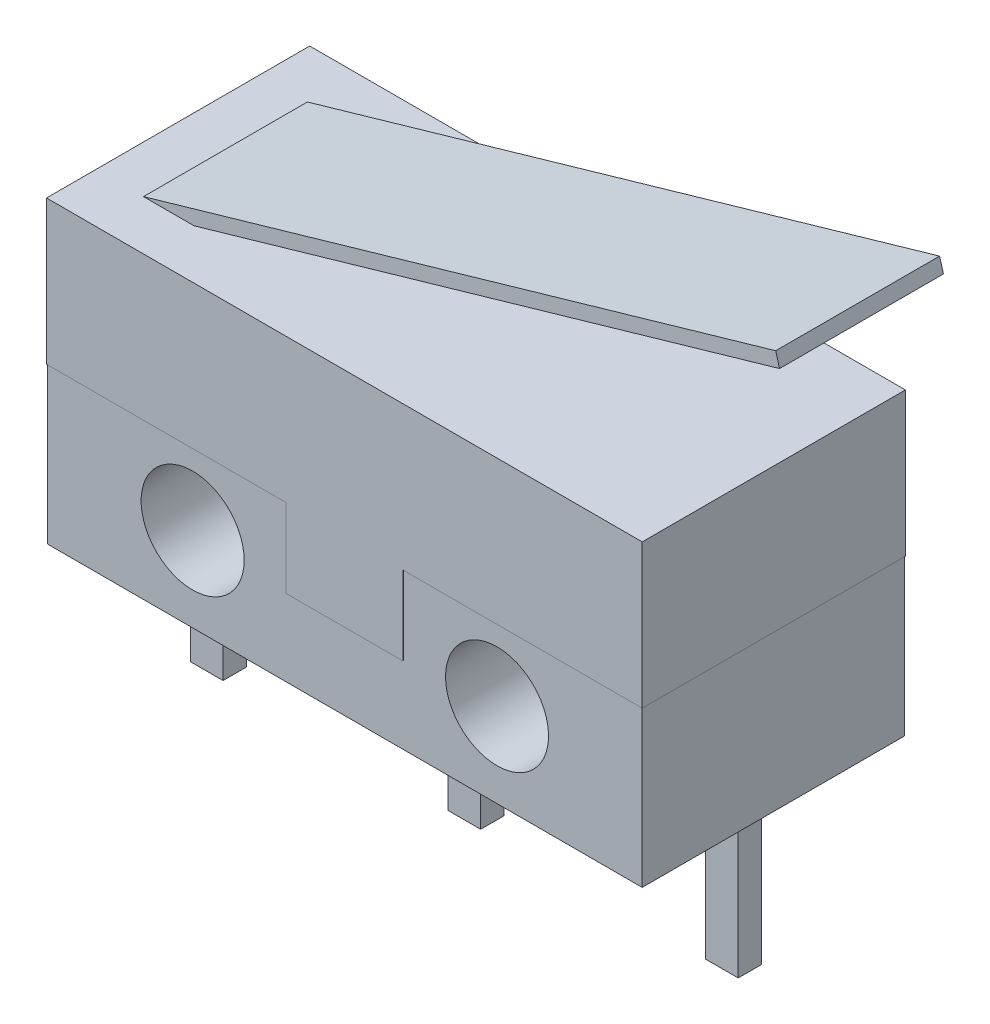
ISO-10303-21;
HEADER;
FILE_DESCRIPTION(('STEP AP214'),'2;1');
FILE_NAME('part.step','',(''),(''),'','','');
FILE_SCHEMA(('AUTOMOTIVE_DESIGN { 1 0 10303 214 1 1 1 1 }'));
ENDSEC;
DATA;
#1=APPLICATION_CONTEXT('core data for automotive mechanical design processes');
#2=APPLICATION_PROTOCOL_DEFINITION('international standard','automotive_design',2000,#1);
#3=PRODUCT_CONTEXT('',#1,'mechanical');
#4=PRODUCT('Part','Part','',(#3));
#5=PRODUCT_RELATED_PRODUCT_CATEGORY('part','',(#4));
#6=PRODUCT_DEFINITION_FORMATION('','',#4);
#7=PRODUCT_DEFINITION_CONTEXT('part definition',#1,'design');
#8=PRODUCT_DEFINITION('design','',#6,#7);
#9=PRODUCT_DEFINITION_SHAPE('','',#8);
#10=(LENGTH_UNIT() NAMED_UNIT(*) SI_UNIT(.MILLI.,.METRE.));
#11=(NAMED_UNIT(*) PLANE_ANGLE_UNIT() SI_UNIT($,.RADIAN.));
#12=(NAMED_UNIT(*) SI_UNIT($,.STERADIAN.) SOLID_ANGLE_UNIT());
#13=UNCERTAINTY_MEASURE_WITH_UNIT(LENGTH_MEASURE(1.E-05),#10,'distance_accuracy_value','');
#14=(GEOMETRIC_REPRESENTATION_CONTEXT(3) GLOBAL_UNCERTAINTY_ASSIGNED_CONTEXT((#13)) GLOBAL_UNIT_ASSIGNED_CONTEXT((#10,
#11,#12)) REPRESENTATION_CONTEXT('',''));
#15=CARTESIAN_POINT('',(0.,0.,0.));
#16=DIRECTION('',(0.,0.,1.));
#17=DIRECTION('',(1.,0.,0.));
#18=AXIS2_PLACEMENT_3D('',#15,#16,#17);
#19=CARTESIAN_POINT('',(6.35,-3.2,2.8));
#20=DIRECTION('',(-1.,0.,0.));
#21=DIRECTION('',(0.,0.,1.));
#22=AXIS2_PLACEMENT_3D('',#19,#20,#21);
#23=PLANE('',#22);
#24=DIRECTION('',(0.,0.,-1.));
#25=VECTOR('',#24,1.);
#26=CARTESIAN_POINT('',(6.35,0.124777874678921,2.81));
#27=LINE('',#26,#25);
#28=CARTESIAN_POINT('',(6.35,0.124777874678921,2.8));
#29=VERTEX_POINT('',#28);
#30=CARTESIAN_POINT('',(6.35,0.124777874678921,-2.8));
#31=VERTEX_POINT('',#30);
#32=EDGE_CURVE('E26',#29,#31,#27,.T.);
#33=ORIENTED_EDGE('',*,*,#32,.F.);
#34=DIRECTION('',(0.,1.,0.));
#35=VECTOR('',#34,1.);
#36=CARTESIAN_POINT('',(6.35,-3.2,2.8));
#37=LINE('',#36,#35);
#38=CARTESIAN_POINT('',(6.35,-3.2,2.8));
#39=VERTEX_POINT('',#38);
#40=EDGE_CURVE('E484',#39,#29,#37,.T.);
#41=ORIENTED_EDGE('',*,*,#40,.F.);
#42=DIRECTION('',(0.,0.,-1.));
#43=VECTOR('',#42,1.);
#44=CARTESIAN_POINT('',(6.35,-3.2,2.8));
#45=LINE('',#44,#43);
#46=CARTESIAN_POINT('',(6.35,-3.2,-2.8));
#47=VERTEX_POINT('',#46);
#48=EDGE_CURVE('E486',#39,#47,#45,.T.);
#49=ORIENTED_EDGE('',*,*,#48,.T.);
#50=DIRECTION('',(0.,1.,0.));
#51=VECTOR('',#50,1.);
#52=CARTESIAN_POINT('',(6.35,-3.2,-2.8));
#53=LINE('',#52,#51);
#54=EDGE_CURVE('E482',#47,#31,#53,.T.);
#55=ORIENTED_EDGE('',*,*,#54,.T.);
#56=EDGE_LOOP('',(#33,#41,#49,#55));
#57=FACE_BOUND('',#56,.T.);
#58=ADVANCED_FACE('F17',(#57),#23,.F.);
#59=CARTESIAN_POINT('',(6.35,-3.2,2.8));
#60=DIRECTION('',(0.,1.,0.));
#61=DIRECTION('',(-1.,0.,0.));
#62=AXIS2_PLACEMENT_3D('',#59,#60,#61);
#63=PLANE('',#62);
#64=DIRECTION('',(0.,0.,-1.));
#65=VECTOR('',#64,1.);
#66=CARTESIAN_POINT('',(5.15,-3.2,-0.25));
#67=LINE('',#66,#65);
#68=CARTESIAN_POINT('',(5.15,-3.2,0.25));
#69=VERTEX_POINT('',#68);
#70=CARTESIAN_POINT('',(5.15,-3.2,-0.25));
#71=VERTEX_POINT('',#70);
#72=EDGE_CURVE('E430',#69,#71,#67,.T.);
#73=ORIENTED_EDGE('',*,*,#72,.F.);
#74=DIRECTION('',(-1.,0.,0.));
#75=VECTOR('',#74,1.);
#76=CARTESIAN_POINT('',(5.85,-3.2,0.25));
#77=LINE('',#76,#75);
#78=CARTESIAN_POINT('',(5.85,-3.2,0.25));
#79=VERTEX_POINT('',#78);
#80=EDGE_CURVE('E400',#79,#69,#77,.T.);
#81=ORIENTED_EDGE('',*,*,#80,.F.);
#82=DIRECTION('',(0.,0.,1.));
#83=VECTOR('',#82,1.);
#84=CARTESIAN_POINT('',(5.85,-3.2,-0.25));
#85=LINE('',#84,#83);
#86=CARTESIAN_POINT('',(5.85,-3.2,-0.25));
#87=VERTEX_POINT('',#86);
#88=EDGE_CURVE('E418',#87,#79,#85,.T.);
#89=ORIENTED_EDGE('',*,*,#88,.F.);
#90=DIRECTION('',(1.,0.,0.));
#91=VECTOR('',#90,1.);
#92=CARTESIAN_POINT('',(5.85,-3.2,-0.25));
#93=LINE('',#92,#91);
#94=EDGE_CURVE('E424',#71,#87,#93,.T.);
#95=ORIENTED_EDGE('',*,*,#94,.F.);
#96=EDGE_LOOP('',(#73,#81,#89,#95));
#97=FACE_BOUND('',#96,.T.);
#98=DIRECTION('',(1.,0.,0.));
#99=VECTOR('',#98,1.);
#100=CARTESIAN_POINT('',(6.35,-3.2,-2.8));
#101=LINE('',#100,#99);
#102=CARTESIAN_POINT('',(-6.35,-3.2,-2.8));
#103=VERTEX_POINT('',#102);
#104=EDGE_CURVE('E488',#103,#47,#101,.T.);
#105=ORIENTED_EDGE('',*,*,#104,.T.);
#106=ORIENTED_EDGE('',*,*,#48,.F.);
#107=DIRECTION('',(1.,0.,0.));
#108=VECTOR('',#107,1.);
#109=CARTESIAN_POINT('',(6.35,-3.2,2.8));
#110=LINE('',#109,#108);
#111=CARTESIAN_POINT('',(-6.35,-3.2,2.8));
#112=VERTEX_POINT('',#111);
#113=EDGE_CURVE('E481',#112,#39,#110,.T.);
#114=ORIENTED_EDGE('',*,*,#113,.F.);
#115=DIRECTION('',(0.,0.,-1.));
#116=VECTOR('',#115,1.);
#117=CARTESIAN_POINT('',(-6.35,-3.2,2.8));
#118=LINE('',#117,#116);
#119=EDGE_CURVE('E21',#112,#103,#118,.T.);
#120=ORIENTED_EDGE('',*,*,#119,.T.);
#121=EDGE_LOOP('',(#105,#106,#114,#120));
#122=FACE_BOUND('',#121,.T.);
#123=DIRECTION('',(0.,0.,-1.));
#124=VECTOR('',#123,1.);
#125=CARTESIAN_POINT('',(-0.35,-3.2,-0.25));
#126=LINE('',#125,#124);
#127=CARTESIAN_POINT('',(-0.35,-3.2,0.25));
#128=VERTEX_POINT('',#127);
#129=CARTESIAN_POINT('',(-0.35,-3.2,-0.25));
#130=VERTEX_POINT('',#129);
#131=EDGE_CURVE('E433',#128,#130,#126,.T.);
#132=ORIENTED_EDGE('',*,*,#131,.F.);
#133=DIRECTION('',(-1.,0.,0.));
#134=VECTOR('',#133,1.);
#135=CARTESIAN_POINT('',(0.35,-3.2,0.25));
#136=LINE('',#135,#134);
#137=CARTESIAN_POINT('',(0.35,-3.2,0.25));
#138=VERTEX_POINT('',#137);
#139=EDGE_CURVE('E438',#138,#128,#136,.T.);
#140=ORIENTED_EDGE('',*,*,#139,.F.);
#141=DIRECTION('',(0.,0.,1.));
#142=VECTOR('',#141,1.);
#143=CARTESIAN_POINT('',(0.35,-3.2,-0.25));
#144=LINE('',#143,#142);
#145=CARTESIAN_POINT('',(0.35,-3.2,-0.25));
#146=VERTEX_POINT('',#145);
#147=EDGE_CURVE('E450',#146,#138,#144,.T.);
#148=ORIENTED_EDGE('',*,*,#147,.F.);
#149=DIRECTION('',(1.,0.,0.));
#150=VECTOR('',#149,1.);
#151=CARTESIAN_POINT('',(0.35,-3.2,-0.25));
#152=LINE('',#151,#150);
#153=EDGE_CURVE('E447',#130,#146,#152,.T.);
#154=ORIENTED_EDGE('',*,*,#153,.F.);
#155=EDGE_LOOP('',(#132,#140,#148,#154));
#156=FACE_BOUND('',#155,.T.);
#157=DIRECTION('',(0.,0.,-1.));
#158=VECTOR('',#157,1.);
#159=CARTESIAN_POINT('',(-5.85,-3.2,-0.25));
#160=LINE('',#159,#158);
#161=CARTESIAN_POINT('',(-5.85,-3.2,0.25));
#162=VERTEX_POINT('',#161);
#163=CARTESIAN_POINT('',(-5.85,-3.2,-0.25));
#164=VERTEX_POINT('',#163);
#165=EDGE_CURVE('E397',#162,#164,#160,.T.);
#166=ORIENTED_EDGE('',*,*,#165,.F.);
#167=DIRECTION('',(-1.,0.,0.));
#168=VECTOR('',#167,1.);
#169=CARTESIAN_POINT('',(-5.15,-3.2,0.25));
#170=LINE('',#169,#168);
#171=CARTESIAN_POINT('',(-5.15,-3.2,0.25));
#172=VERTEX_POINT('',#171);
#173=EDGE_CURVE('E367',#172,#162,#170,.T.);
#174=ORIENTED_EDGE('',*,*,#173,.F.);
#175=DIRECTION('',(0.,0.,1.));
#176=VECTOR('',#175,1.);
#177=CARTESIAN_POINT('',(-5.15,-3.2,-0.25));
#178=LINE('',#177,#176);
#179=CARTESIAN_POINT('',(-5.15,-3.2,-0.25));
#180=VERTEX_POINT('',#179);
#181=EDGE_CURVE('E385',#180,#172,#178,.T.);
#182=ORIENTED_EDGE('',*,*,#181,.F.);
#183=DIRECTION('',(1.,0.,0.));
#184=VECTOR('',#183,1.);
#185=CARTESIAN_POINT('',(-5.15,-3.2,-0.25));
#186=LINE('',#185,#184);
#187=EDGE_CURVE('E391',#164,#180,#186,.T.);
#188=ORIENTED_EDGE('',*,*,#187,.F.);
#189=EDGE_LOOP('',(#166,#174,#182,#188));
#190=FACE_BOUND('',#189,.T.);
#191=ADVANCED_FACE('F500',(#97,#122,#156,#190),#63,.F.);
#192=CARTESIAN_POINT('',(0.,0.,2.8));
#193=DIRECTION('',(0.,0.,1.));
#194=DIRECTION('',(1.,0.,0.));
#195=AXIS2_PLACEMENT_3D('',#192,#193,#194);
#196=PLANE('',#195);
#197=DIRECTION('',(1.,0.,0.));
#198=VECTOR('',#197,1.);
#199=CARTESIAN_POINT('',(1.25,0.124777874678922,2.8));
#200=LINE('',#199,#198);
#201=CARTESIAN_POINT('',(1.25,0.124777874678922,2.8));
#202=VERTEX_POINT('',#201);
#203=EDGE_CURVE('E40',#202,#29,#200,.T.);
#204=ORIENTED_EDGE('',*,*,#203,.F.);
#205=DIRECTION('',(0.,1.,0.));
#206=VECTOR('',#205,1.);
#207=CARTESIAN_POINT('',(1.25,-1.55638339758589,2.8));
#208=LINE('',#207,#206);
#209=CARTESIAN_POINT('',(1.25,-1.55638339758589,2.8));
#210=VERTEX_POINT('',#209);
#211=EDGE_CURVE('E323',#210,#202,#208,.T.);
#212=ORIENTED_EDGE('',*,*,#211,.F.);
#213=DIRECTION('',(1.,0.,0.));
#214=VECTOR('',#213,1.);
#215=CARTESIAN_POINT('',(-1.25,-1.55638339758589,2.8));
#216=LINE('',#215,#214);
#217=CARTESIAN_POINT('',(-1.25,-1.55638339758589,2.8));
#218=VERTEX_POINT('',#217);
#219=EDGE_CURVE('E320',#218,#210,#216,.T.);
#220=ORIENTED_EDGE('',*,*,#219,.F.);
#221=DIRECTION('',(0.,-1.,0.));
#222=VECTOR('',#221,1.);
#223=CARTESIAN_POINT('',(-1.25,0.124777874678921,2.8));
#224=LINE('',#223,#222);
#225=CARTESIAN_POINT('',(-1.25,0.124777874678921,2.8));
#226=VERTEX_POINT('',#225);
#227=EDGE_CURVE('E317',#226,#218,#224,.T.);
#228=ORIENTED_EDGE('',*,*,#227,.F.);
#229=DIRECTION('',(1.,0.,0.));
#230=VECTOR('',#229,1.);
#231=CARTESIAN_POINT('',(-6.35,0.124777874678921,2.8));
#232=LINE('',#231,#230);
#233=CARTESIAN_POINT('',(-6.35,0.124777874678921,2.8));
#234=VERTEX_POINT('',#233);
#235=EDGE_CURVE('E305',#234,#226,#232,.T.);
#236=ORIENTED_EDGE('',*,*,#235,.F.);
#237=DIRECTION('',(0.,-1.,0.));
#238=VECTOR('',#237,1.);
#239=CARTESIAN_POINT('',(-6.35,-3.2,2.8));
#240=LINE('',#239,#238);
#241=EDGE_CURVE('E479',#234,#112,#240,.T.);
#242=ORIENTED_EDGE('',*,*,#241,.T.);
#243=ORIENTED_EDGE('',*,*,#113,.T.);
#244=ORIENTED_EDGE('',*,*,#40,.T.);
#245=EDGE_LOOP('',(#204,#212,#220,#228,#236,#242,#243,#244));
#246=FACE_BOUND('',#245,.T.);
#247=CARTESIAN_POINT('',(-3.25,-1.4,2.8));
#248=DIRECTION('',(0.,0.,1.));
#249=DIRECTION('',(1.,0.,0.));
#250=AXIS2_PLACEMENT_3D('',#247,#248,#249);
#251=CIRCLE('',#250,1.1);
#252=CARTESIAN_POINT('',(-2.15,-1.4,2.8));
#253=VERTEX_POINT('',#252);
#254=EDGE_CURVE('E473',#253,#253,#251,.T.);
#255=ORIENTED_EDGE('',*,*,#254,.F.);
#256=EDGE_LOOP('',(#255));
#257=FACE_BOUND('',#256,.T.);
#258=CARTESIAN_POINT('',(3.25,-1.4,2.8));
#259=DIRECTION('',(0.,0.,1.));
#260=DIRECTION('',(-1.,0.,0.));
#261=AXIS2_PLACEMENT_3D('',#258,#259,#260);
#262=CIRCLE('',#261,1.1);
#263=CARTESIAN_POINT('',(2.15,-1.4,2.8));
#264=VERTEX_POINT('',#263);
#265=EDGE_CURVE('E467',#264,#264,#262,.T.);
#266=ORIENTED_EDGE('',*,*,#265,.F.);
#267=EDGE_LOOP('',(#266));
#268=FACE_BOUND('',#267,.T.);
#269=ADVANCED_FACE('F510',(#246,#257,#268),#196,.T.);
#270=CARTESIAN_POINT('',(0.,0.,-2.8));
#271=DIRECTION('',(0.,0.,1.));
#272=DIRECTION('',(1.,0.,0.));
#273=AXIS2_PLACEMENT_3D('',#270,#271,#272);
#274=PLANE('',#273);
#275=DIRECTION('',(0.,-1.,0.));
#276=VECTOR('',#275,1.);
#277=CARTESIAN_POINT('',(-6.35,-3.2,-2.8));
#278=LINE('',#277,#276);
#279=CARTESIAN_POINT('',(-6.35,0.124777874678921,-2.8));
#280=VERTEX_POINT('',#279);
#281=EDGE_CURVE('E476',#280,#103,#278,.T.);
#282=ORIENTED_EDGE('',*,*,#281,.F.);
#283=DIRECTION('',(1.,0.,0.));
#284=VECTOR('',#283,1.);
#285=CARTESIAN_POINT('',(-6.35,0.124777874678921,-2.8));
#286=LINE('',#285,#284);
#287=CARTESIAN_POINT('',(-1.25,0.124777874678921,-2.8));
#288=VERTEX_POINT('',#287);
#289=EDGE_CURVE('E271',#280,#288,#286,.T.);
#290=ORIENTED_EDGE('',*,*,#289,.T.);
#291=DIRECTION('',(0.,-1.,0.));
#292=VECTOR('',#291,1.);
#293=CARTESIAN_POINT('',(-1.25,0.124777874678921,-2.8));
#294=LINE('',#293,#292);
#295=CARTESIAN_POINT('',(-1.25,-1.55638339758589,-2.8));
#296=VERTEX_POINT('',#295);
#297=EDGE_CURVE('E293',#288,#296,#294,.T.);
#298=ORIENTED_EDGE('',*,*,#297,.T.);
#299=DIRECTION('',(1.,0.,0.));
#300=VECTOR('',#299,1.);
#301=CARTESIAN_POINT('',(-1.25,-1.55638339758589,-2.8));
#302=LINE('',#301,#300);
#303=CARTESIAN_POINT('',(1.25,-1.55638339758589,-2.8));
#304=VERTEX_POINT('',#303);
#305=EDGE_CURVE('E290',#296,#304,#302,.T.);
#306=ORIENTED_EDGE('',*,*,#305,.T.);
#307=DIRECTION('',(0.,1.,0.));
#308=VECTOR('',#307,1.);
#309=CARTESIAN_POINT('',(1.25,-1.55638339758589,-2.8));
#310=LINE('',#309,#308);
#311=CARTESIAN_POINT('',(1.25,0.124777874678922,-2.8));
#312=VERTEX_POINT('',#311);
#313=EDGE_CURVE('E287',#304,#312,#310,.T.);
#314=ORIENTED_EDGE('',*,*,#313,.T.);
#315=DIRECTION('',(1.,0.,0.));
#316=VECTOR('',#315,1.);
#317=CARTESIAN_POINT('',(1.25,0.124777874678922,-2.8));
#318=LINE('',#317,#316);
#319=EDGE_CURVE('E267',#312,#31,#318,.T.);
#320=ORIENTED_EDGE('',*,*,#319,.T.);
#321=ORIENTED_EDGE('',*,*,#54,.F.);
#322=ORIENTED_EDGE('',*,*,#104,.F.);
#323=EDGE_LOOP('',(#282,#290,#298,#306,#314,#320,#321,#322));
#324=FACE_BOUND('',#323,.T.);
#325=CARTESIAN_POINT('',(-3.25,-1.4,-2.8));
#326=DIRECTION('',(0.,0.,1.));
#327=DIRECTION('',(1.,0.,0.));
#328=AXIS2_PLACEMENT_3D('',#325,#326,#327);
#329=CIRCLE('',#328,1.1);
#330=CARTESIAN_POINT('',(-2.15,-1.4,-2.8));
#331=VERTEX_POINT('',#330);
#332=EDGE_CURVE('E470',#331,#331,#329,.T.);
#333=ORIENTED_EDGE('',*,*,#332,.T.);
#334=EDGE_LOOP('',(#333));
#335=FACE_BOUND('',#334,.T.);
#336=CARTESIAN_POINT('',(3.25,-1.4,-2.8));
#337=DIRECTION('',(0.,0.,1.));
#338=DIRECTION('',(-1.,0.,0.));
#339=AXIS2_PLACEMENT_3D('',#336,#337,#338);
#340=CIRCLE('',#339,1.1);
#341=CARTESIAN_POINT('',(2.15,-1.4,-2.8));
#342=VERTEX_POINT('',#341);
#343=EDGE_CURVE('E466',#342,#342,#340,.T.);
#344=ORIENTED_EDGE('',*,*,#343,.T.);
#345=EDGE_LOOP('',(#344));
#346=FACE_BOUND('',#345,.T.);
#347=ADVANCED_FACE('F508',(#324,#335,#346),#274,.F.);
#348=CARTESIAN_POINT('',(-6.35,-3.2,2.8));
#349=DIRECTION('',(1.,0.,0.));
#350=DIRECTION('',(0.,0.,-1.));
#351=AXIS2_PLACEMENT_3D('',#348,#349,#350);
#352=PLANE('',#351);
#353=ORIENTED_EDGE('',*,*,#241,.F.);
#354=DIRECTION('',(0.,0.,-1.));
#355=VECTOR('',#354,1.);
#356=CARTESIAN_POINT('',(-6.35,0.124777874678921,2.81));
#357=LINE('',#356,#355);
#358=EDGE_CURVE('E11',#234,#280,#357,.T.);
#359=ORIENTED_EDGE('',*,*,#358,.T.);
#360=ORIENTED_EDGE('',*,*,#281,.T.);
#361=ORIENTED_EDGE('',*,*,#119,.F.);
#362=EDGE_LOOP('',(#353,#359,#360,#361));
#363=FACE_BOUND('',#362,.T.);
#364=ADVANCED_FACE('F19',(#363),#352,.F.);
#365=CARTESIAN_POINT('',(6.35,3.2,2.8));
#366=DIRECTION('',(0.,-1.,0.));
#367=DIRECTION('',(1.,0.,0.));
#368=AXIS2_PLACEMENT_3D('',#365,#366,#367);
#369=PLANE('',#368);
#370=DIRECTION('',(0.,0.,-1.));
#371=VECTOR('',#370,1.);
#372=CARTESIAN_POINT('',(-4.26907337581873,3.2,1.75));
#373=LINE('',#372,#371);
#374=CARTESIAN_POINT('',(-4.26907337581873,3.2,1.75));
#375=VERTEX_POINT('',#374);
#376=CARTESIAN_POINT('',(-4.26907337581873,3.2,-1.75));
#377=VERTEX_POINT('',#376);
#378=EDGE_CURVE('E364',#375,#377,#373,.T.);
#379=ORIENTED_EDGE('',*,*,#378,.F.);
#380=DIRECTION('',(1.,0.,0.));
#381=VECTOR('',#380,1.);
#382=CARTESIAN_POINT('',(-4.26907337581873,3.2,1.75));
#383=LINE('',#382,#381);
#384=CARTESIAN_POINT('',(-5.35,3.2,1.75));
#385=VERTEX_POINT('',#384);
#386=EDGE_CURVE('E338',#385,#375,#383,.T.);
#387=ORIENTED_EDGE('',*,*,#386,.F.);
#388=DIRECTION('',(0.,0.,-1.));
#389=VECTOR('',#388,1.);
#390=CARTESIAN_POINT('',(-5.35,3.2,1.75));
#391=LINE('',#390,#389);
#392=CARTESIAN_POINT('',(-5.35,3.2,-1.75));
#393=VERTEX_POINT('',#392);
#394=EDGE_CURVE('E349',#385,#393,#391,.T.);
#395=ORIENTED_EDGE('',*,*,#394,.T.);
#396=DIRECTION('',(1.,0.,0.));
#397=VECTOR('',#396,1.);
#398=CARTESIAN_POINT('',(-4.26907337581873,3.2,-1.75));
#399=LINE('',#398,#397);
#400=EDGE_CURVE('E337',#393,#377,#399,.T.);
#401=ORIENTED_EDGE('',*,*,#400,.T.);
#402=EDGE_LOOP('',(#379,#387,#395,#401));
#403=FACE_BOUND('',#402,.T.);
#404=DIRECTION('',(-1.,0.,0.));
#405=VECTOR('',#404,1.);
#406=CARTESIAN_POINT('',(-6.35,3.2,2.81));
#407=LINE('',#406,#405);
#408=CARTESIAN_POINT('',(6.36,3.2,2.81));
#409=VERTEX_POINT('',#408);
#410=CARTESIAN_POINT('',(-6.36,3.2,2.81));
#411=VERTEX_POINT('',#410);
#412=EDGE_CURVE('E228',#409,#411,#407,.T.);
#413=ORIENTED_EDGE('',*,*,#412,.F.);
#414=DIRECTION('',(0.,0.,1.));
#415=VECTOR('',#414,1.);
#416=CARTESIAN_POINT('',(6.36,3.2,2.81));
#417=LINE('',#416,#415);
#418=CARTESIAN_POINT('',(6.36,3.2,-2.81));
#419=VERTEX_POINT('',#418);
#420=EDGE_CURVE('E265',#419,#409,#417,.T.);
#421=ORIENTED_EDGE('',*,*,#420,.F.);
#422=DIRECTION('',(-1.,0.,0.));
#423=VECTOR('',#422,1.);
#424=CARTESIAN_POINT('',(-6.35,3.2,-2.81));
#425=LINE('',#424,#423);
#426=CARTESIAN_POINT('',(-6.36,3.2,-2.81));
#427=VERTEX_POINT('',#426);
#428=EDGE_CURVE('E252',#419,#427,#425,.T.);
#429=ORIENTED_EDGE('',*,*,#428,.T.);
#430=DIRECTION('',(0.,0.,1.));
#431=VECTOR('',#430,1.);
#432=CARTESIAN_POINT('',(-6.36,3.2,2.81));
#433=LINE('',#432,#431);
#434=EDGE_CURVE('E246',#427,#411,#433,.T.);
#435=ORIENTED_EDGE('',*,*,#434,.T.);
#436=EDGE_LOOP('',(#413,#421,#429,#435));
#437=FACE_BOUND('',#436,.T.);
#438=ADVANCED_FACE('F251',(#403,#437),#369,.F.);
#439=CARTESIAN_POINT('',(-3.25,-1.4,2.8));
#440=DIRECTION('',(0.,0.,-1.));
#441=DIRECTION('',(-1.,0.,0.));
#442=AXIS2_PLACEMENT_3D('',#439,#440,#441);
#443=CYLINDRICAL_SURFACE('',#442,1.1);
#444=ORIENTED_EDGE('',*,*,#254,.T.);
#445=EDGE_LOOP('',(#444));
#446=FACE_BOUND('',#445,.T.);
#447=ORIENTED_EDGE('',*,*,#332,.F.);
#448=EDGE_LOOP('',(#447));
#449=FACE_BOUND('',#448,.T.);
#450=ADVANCED_FACE('F568',(#446,#449),#443,.F.);
#451=CARTESIAN_POINT('',(3.25,-1.4,2.8));
#452=DIRECTION('',(0.,0.,-1.));
#453=DIRECTION('',(-1.,0.,0.));
#454=AXIS2_PLACEMENT_3D('',#451,#452,#453);
#455=CYLINDRICAL_SURFACE('',#454,1.1);
#456=ORIENTED_EDGE('',*,*,#265,.T.);
#457=EDGE_LOOP('',(#456));
#458=FACE_BOUND('',#457,.T.);
#459=ORIENTED_EDGE('',*,*,#343,.F.);
#460=EDGE_LOOP('',(#459));
#461=FACE_BOUND('',#460,.T.);
#462=ADVANCED_FACE('F576',(#458,#461),#455,.F.);
#463=CARTESIAN_POINT('',(-0.35,-6.4,-0.25));
#464=DIRECTION('',(1.,0.,0.));
#465=DIRECTION('',(0.,1.,0.));
#466=AXIS2_PLACEMENT_3D('',#463,#464,#465);
#467=PLANE('',#466);
#468=ORIENTED_EDGE('',*,*,#131,.T.);
#469=DIRECTION('',(0.,1.,0.));
#470=VECTOR('',#469,1.);
#471=CARTESIAN_POINT('',(-0.35,-6.4,-0.25));
#472=LINE('',#471,#470);
#473=CARTESIAN_POINT('',(-0.35,-6.4,-0.25));
#474=VERTEX_POINT('',#473);
#475=EDGE_CURVE('E463',#474,#130,#472,.T.);
#476=ORIENTED_EDGE('',*,*,#475,.F.);
#477=DIRECTION('',(0.,0.,-1.));
#478=VECTOR('',#477,1.);
#479=CARTESIAN_POINT('',(-0.35,-6.4,-0.25));
#480=LINE('',#479,#478);
#481=CARTESIAN_POINT('',(-0.35,-6.4,0.25));
#482=VERTEX_POINT('',#481);
#483=EDGE_CURVE('E434',#482,#474,#480,.T.);
#484=ORIENTED_EDGE('',*,*,#483,.F.);
#485=DIRECTION('',(0.,1.,0.));
#486=VECTOR('',#485,1.);
#487=CARTESIAN_POINT('',(-0.35,-6.4,0.25));
#488=LINE('',#487,#486);
#489=EDGE_CURVE('E444',#482,#128,#488,.T.);
#490=ORIENTED_EDGE('',*,*,#489,.T.);
#491=EDGE_LOOP('',(#468,#476,#484,#490));
#492=FACE_BOUND('',#491,.T.);
#493=ADVANCED_FACE('F580',(#492),#467,.F.);
#494=CARTESIAN_POINT('',(0.35,-6.4,-0.25));
#495=DIRECTION('',(0.,0.,1.));
#496=DIRECTION('',(1.,0.,0.));
#497=AXIS2_PLACEMENT_3D('',#494,#495,#496);
#498=PLANE('',#497);
#499=ORIENTED_EDGE('',*,*,#153,.T.);
#500=DIRECTION('',(0.,1.,0.));
#501=VECTOR('',#500,1.);
#502=CARTESIAN_POINT('',(0.35,-6.4,-0.25));
#503=LINE('',#502,#501);
#504=CARTESIAN_POINT('',(0.35,-6.4,-0.25));
#505=VERTEX_POINT('',#504);
#506=EDGE_CURVE('E460',#505,#146,#503,.T.);
#507=ORIENTED_EDGE('',*,*,#506,.F.);
#508=DIRECTION('',(1.,0.,0.));
#509=VECTOR('',#508,1.);
#510=CARTESIAN_POINT('',(0.35,-6.4,-0.25));
#511=LINE('',#510,#509);
#512=EDGE_CURVE('E437',#474,#505,#511,.T.);
#513=ORIENTED_EDGE('',*,*,#512,.F.);
#514=ORIENTED_EDGE('',*,*,#475,.T.);
#515=EDGE_LOOP('',(#499,#507,#513,#514));
#516=FACE_BOUND('',#515,.T.);
#517=ADVANCED_FACE('F584',(#516),#498,.F.);
#518=CARTESIAN_POINT('',(0.35,-6.4,-0.25));
#519=DIRECTION('',(-1.,0.,0.));
#520=DIRECTION('',(0.,-1.,0.));
#521=AXIS2_PLACEMENT_3D('',#518,#519,#520);
#522=PLANE('',#521);
#523=ORIENTED_EDGE('',*,*,#147,.T.);
#524=DIRECTION('',(0.,1.,0.));
#525=VECTOR('',#524,1.);
#526=CARTESIAN_POINT('',(0.35,-6.4,0.25));
#527=LINE('',#526,#525);
#528=CARTESIAN_POINT('',(0.35,-6.4,0.25));
#529=VERTEX_POINT('',#528);
#530=EDGE_CURVE('E457',#529,#138,#527,.T.);
#531=ORIENTED_EDGE('',*,*,#530,.F.);
#532=DIRECTION('',(0.,0.,1.));
#533=VECTOR('',#532,1.);
#534=CARTESIAN_POINT('',(0.35,-6.4,-0.25));
#535=LINE('',#534,#533);
#536=EDGE_CURVE('E440',#505,#529,#535,.T.);
#537=ORIENTED_EDGE('',*,*,#536,.F.);
#538=ORIENTED_EDGE('',*,*,#506,.T.);
#539=EDGE_LOOP('',(#523,#531,#537,#538));
#540=FACE_BOUND('',#539,.T.);
#541=ADVANCED_FACE('F588',(#540),#522,.F.);
#542=CARTESIAN_POINT('',(0.35,-6.4,0.25));
#543=DIRECTION('',(0.,0.,-1.));
#544=DIRECTION('',(-1.,0.,0.));
#545=AXIS2_PLACEMENT_3D('',#542,#543,#544);
#546=PLANE('',#545);
#547=ORIENTED_EDGE('',*,*,#139,.T.);
#548=ORIENTED_EDGE('',*,*,#489,.F.);
#549=DIRECTION('',(-1.,0.,0.));
#550=VECTOR('',#549,1.);
#551=CARTESIAN_POINT('',(0.35,-6.4,0.25));
#552=LINE('',#551,#550);
#553=EDGE_CURVE('E442',#529,#482,#552,.T.);
#554=ORIENTED_EDGE('',*,*,#553,.F.);
#555=ORIENTED_EDGE('',*,*,#530,.T.);
#556=EDGE_LOOP('',(#547,#548,#554,#555));
#557=FACE_BOUND('',#556,.T.);
#558=ADVANCED_FACE('F592',(#557),#546,.F.);
#559=CARTESIAN_POINT('',(0.,-6.4,0.));
#560=DIRECTION('',(0.,-1.,0.));
#561=DIRECTION('',(0.,0.,-1.));
#562=AXIS2_PLACEMENT_3D('',#559,#560,#561);
#563=PLANE('',#562);
#564=ORIENTED_EDGE('',*,*,#483,.T.);
#565=ORIENTED_EDGE('',*,*,#512,.T.);
#566=ORIENTED_EDGE('',*,*,#536,.T.);
#567=ORIENTED_EDGE('',*,*,#553,.T.);
#568=EDGE_LOOP('',(#564,#565,#566,#567));
#569=FACE_BOUND('',#568,.T.);
#570=ADVANCED_FACE('F596',(#569),#563,.T.);
#571=CARTESIAN_POINT('',(5.15,-6.4,-0.25));
#572=DIRECTION('',(1.,0.,0.));
#573=DIRECTION('',(0.,1.,0.));
#574=AXIS2_PLACEMENT_3D('',#571,#572,#573);
#575=PLANE('',#574);
#576=ORIENTED_EDGE('',*,*,#72,.T.);
#577=DIRECTION('',(0.,1.,0.));
#578=VECTOR('',#577,1.);
#579=CARTESIAN_POINT('',(5.15,-6.4,-0.25));
#580=LINE('',#579,#578);
#581=CARTESIAN_POINT('',(5.15,-6.4,-0.25));
#582=VERTEX_POINT('',#581);
#583=EDGE_CURVE('E427',#582,#71,#580,.T.);
#584=ORIENTED_EDGE('',*,*,#583,.F.);
#585=DIRECTION('',(0.,0.,-1.));
#586=VECTOR('',#585,1.);
#587=CARTESIAN_POINT('',(5.15,-6.4,-0.25));
#588=LINE('',#587,#586);
#589=CARTESIAN_POINT('',(5.15,-6.4,0.25));
#590=VERTEX_POINT('',#589);
#591=EDGE_CURVE('E403',#590,#582,#588,.T.);
#592=ORIENTED_EDGE('',*,*,#591,.F.);
#593=DIRECTION('',(0.,1.,0.));
#594=VECTOR('',#593,1.);
#595=CARTESIAN_POINT('',(5.15,-6.4,0.25));
#596=LINE('',#595,#594);
#597=EDGE_CURVE('E412',#590,#69,#596,.T.);
#598=ORIENTED_EDGE('',*,*,#597,.T.);
#599=EDGE_LOOP('',(#576,#584,#592,#598));
#600=FACE_BOUND('',#599,.T.);
#601=ADVANCED_FACE('F600',(#600),#575,.F.);
#602=CARTESIAN_POINT('',(5.85,-6.4,-0.25));
#603=DIRECTION('',(0.,0.,1.));
#604=DIRECTION('',(1.,0.,0.));
#605=AXIS2_PLACEMENT_3D('',#602,#603,#604);
#606=PLANE('',#605);
#607=ORIENTED_EDGE('',*,*,#94,.T.);
#608=DIRECTION('',(0.,1.,0.));
#609=VECTOR('',#608,1.);
#610=CARTESIAN_POINT('',(5.85,-6.4,-0.25));
#611=LINE('',#610,#609);
#612=CARTESIAN_POINT('',(5.85,-6.4,-0.25));
#613=VERTEX_POINT('',#612);
#614=EDGE_CURVE('E421',#613,#87,#611,.T.);
#615=ORIENTED_EDGE('',*,*,#614,.F.);
#616=DIRECTION('',(1.,0.,0.));
#617=VECTOR('',#616,1.);
#618=CARTESIAN_POINT('',(5.85,-6.4,-0.25));
#619=LINE('',#618,#617);
#620=EDGE_CURVE('E405',#582,#613,#619,.T.);
#621=ORIENTED_EDGE('',*,*,#620,.F.);
#622=ORIENTED_EDGE('',*,*,#583,.T.);
#623=EDGE_LOOP('',(#607,#615,#621,#622));
#624=FACE_BOUND('',#623,.T.);
#625=ADVANCED_FACE('F604',(#624),#606,.F.);
#626=CARTESIAN_POINT('',(5.85,-6.4,-0.25));
#627=DIRECTION('',(-1.,0.,0.));
#628=DIRECTION('',(0.,-1.,0.));
#629=AXIS2_PLACEMENT_3D('',#626,#627,#628);
#630=PLANE('',#629);
#631=ORIENTED_EDGE('',*,*,#88,.T.);
#632=DIRECTION('',(0.,1.,0.));
#633=VECTOR('',#632,1.);
#634=CARTESIAN_POINT('',(5.85,-6.4,0.25));
#635=LINE('',#634,#633);
#636=CARTESIAN_POINT('',(5.85,-6.4,0.25));
#637=VERTEX_POINT('',#636);
#638=EDGE_CURVE('E415',#637,#79,#635,.T.);
#639=ORIENTED_EDGE('',*,*,#638,.F.);
#640=DIRECTION('',(0.,0.,1.));
#641=VECTOR('',#640,1.);
#642=CARTESIAN_POINT('',(5.85,-6.4,-0.25));
#643=LINE('',#642,#641);
#644=EDGE_CURVE('E407',#613,#637,#643,.T.);
#645=ORIENTED_EDGE('',*,*,#644,.F.);
#646=ORIENTED_EDGE('',*,*,#614,.T.);
#647=EDGE_LOOP('',(#631,#639,#645,#646));
#648=FACE_BOUND('',#647,.T.);
#649=ADVANCED_FACE('F608',(#648),#630,.F.);
#650=CARTESIAN_POINT('',(5.85,-6.4,0.25));
#651=DIRECTION('',(0.,0.,-1.));
#652=DIRECTION('',(-1.,0.,0.));
#653=AXIS2_PLACEMENT_3D('',#650,#651,#652);
#654=PLANE('',#653);
#655=ORIENTED_EDGE('',*,*,#80,.T.);
#656=ORIENTED_EDGE('',*,*,#597,.F.);
#657=DIRECTION('',(-1.,0.,0.));
#658=VECTOR('',#657,1.);
#659=CARTESIAN_POINT('',(5.85,-6.4,0.25));
#660=LINE('',#659,#658);
#661=EDGE_CURVE('E409',#637,#590,#660,.T.);
#662=ORIENTED_EDGE('',*,*,#661,.F.);
#663=ORIENTED_EDGE('',*,*,#638,.T.);
#664=EDGE_LOOP('',(#655,#656,#662,#663));
#665=FACE_BOUND('',#664,.T.);
#666=ADVANCED_FACE('F612',(#665),#654,.F.);
#667=CARTESIAN_POINT('',(5.5,-6.4,0.));
#668=DIRECTION('',(0.,-1.,0.));
#669=DIRECTION('',(0.,0.,-1.));
#670=AXIS2_PLACEMENT_3D('',#667,#668,#669);
#671=PLANE('',#670);
#672=ORIENTED_EDGE('',*,*,#591,.T.);
#673=ORIENTED_EDGE('',*,*,#620,.T.);
#674=ORIENTED_EDGE('',*,*,#644,.T.);
#675=ORIENTED_EDGE('',*,*,#661,.T.);
#676=EDGE_LOOP('',(#672,#673,#674,#675));
#677=FACE_BOUND('',#676,.T.);
#678=ADVANCED_FACE('F616',(#677),#671,.T.);
#679=CARTESIAN_POINT('',(-5.85,-6.4,-0.25));
#680=DIRECTION('',(1.,0.,0.));
#681=DIRECTION('',(0.,1.,0.));
#682=AXIS2_PLACEMENT_3D('',#679,#680,#681);
#683=PLANE('',#682);
#684=ORIENTED_EDGE('',*,*,#165,.T.);
#685=DIRECTION('',(0.,1.,0.));
#686=VECTOR('',#685,1.);
#687=CARTESIAN_POINT('',(-5.85,-6.4,-0.25));
#688=LINE('',#687,#686);
#689=CARTESIAN_POINT('',(-5.85,-6.4,-0.25));
#690=VERTEX_POINT('',#689);
#691=EDGE_CURVE('E394',#690,#164,#688,.T.);
#692=ORIENTED_EDGE('',*,*,#691,.F.);
#693=DIRECTION('',(0.,0.,-1.));
#694=VECTOR('',#693,1.);
#695=CARTESIAN_POINT('',(-5.85,-6.4,-0.25));
#696=LINE('',#695,#694);
#697=CARTESIAN_POINT('',(-5.85,-6.4,0.25));
#698=VERTEX_POINT('',#697);
#699=EDGE_CURVE('E370',#698,#690,#696,.T.);
#700=ORIENTED_EDGE('',*,*,#699,.F.);
#701=DIRECTION('',(0.,1.,0.));
#702=VECTOR('',#701,1.);
#703=CARTESIAN_POINT('',(-5.85,-6.4,0.25));
#704=LINE('',#703,#702);
#705=EDGE_CURVE('E379',#698,#162,#704,.T.);
#706=ORIENTED_EDGE('',*,*,#705,.T.);
#707=EDGE_LOOP('',(#684,#692,#700,#706));
#708=FACE_BOUND('',#707,.T.);
#709=ADVANCED_FACE('F620',(#708),#683,.F.);
#710=CARTESIAN_POINT('',(-5.15,-6.4,-0.25));
#711=DIRECTION('',(0.,0.,1.));
#712=DIRECTION('',(1.,0.,0.));
#713=AXIS2_PLACEMENT_3D('',#710,#711,#712);
#714=PLANE('',#713);
#715=ORIENTED_EDGE('',*,*,#187,.T.);
#716=DIRECTION('',(0.,1.,0.));
#717=VECTOR('',#716,1.);
#718=CARTESIAN_POINT('',(-5.15,-6.4,-0.25));
#719=LINE('',#718,#717);
#720=CARTESIAN_POINT('',(-5.15,-6.4,-0.25));
#721=VERTEX_POINT('',#720);
#722=EDGE_CURVE('E388',#721,#180,#719,.T.);
#723=ORIENTED_EDGE('',*,*,#722,.F.);
#724=DIRECTION('',(1.,0.,0.));
#725=VECTOR('',#724,1.);
#726=CARTESIAN_POINT('',(-5.15,-6.4,-0.25));
#727=LINE('',#726,#725);
#728=EDGE_CURVE('E372',#690,#721,#727,.T.);
#729=ORIENTED_EDGE('',*,*,#728,.F.);
#730=ORIENTED_EDGE('',*,*,#691,.T.);
#731=EDGE_LOOP('',(#715,#723,#729,#730));
#732=FACE_BOUND('',#731,.T.);
#733=ADVANCED_FACE('F624',(#732),#714,.F.);
#734=CARTESIAN_POINT('',(-5.15,-6.4,-0.25));
#735=DIRECTION('',(-1.,0.,0.));
#736=DIRECTION('',(0.,-1.,0.));
#737=AXIS2_PLACEMENT_3D('',#734,#735,#736);
#738=PLANE('',#737);
#739=ORIENTED_EDGE('',*,*,#181,.T.);
#740=DIRECTION('',(0.,1.,0.));
#741=VECTOR('',#740,1.);
#742=CARTESIAN_POINT('',(-5.15,-6.4,0.25));
#743=LINE('',#742,#741);
#744=CARTESIAN_POINT('',(-5.15,-6.4,0.25));
#745=VERTEX_POINT('',#744);
#746=EDGE_CURVE('E382',#745,#172,#743,.T.);
#747=ORIENTED_EDGE('',*,*,#746,.F.);
#748=DIRECTION('',(0.,0.,1.));
#749=VECTOR('',#748,1.);
#750=CARTESIAN_POINT('',(-5.15,-6.4,-0.25));
#751=LINE('',#750,#749);
#752=EDGE_CURVE('E374',#721,#745,#751,.T.);
#753=ORIENTED_EDGE('',*,*,#752,.F.);
#754=ORIENTED_EDGE('',*,*,#722,.T.);
#755=EDGE_LOOP('',(#739,#747,#753,#754));
#756=FACE_BOUND('',#755,.T.);
#757=ADVANCED_FACE('F628',(#756),#738,.F.);
#758=CARTESIAN_POINT('',(-5.15,-6.4,0.25));
#759=DIRECTION('',(0.,0.,-1.));
#760=DIRECTION('',(-1.,0.,0.));
#761=AXIS2_PLACEMENT_3D('',#758,#759,#760);
#762=PLANE('',#761);
#763=ORIENTED_EDGE('',*,*,#173,.T.);
#764=ORIENTED_EDGE('',*,*,#705,.F.);
#765=DIRECTION('',(-1.,0.,0.));
#766=VECTOR('',#765,1.);
#767=CARTESIAN_POINT('',(-5.15,-6.4,0.25));
#768=LINE('',#767,#766);
#769=EDGE_CURVE('E376',#745,#698,#768,.T.);
#770=ORIENTED_EDGE('',*,*,#769,.F.);
#771=ORIENTED_EDGE('',*,*,#746,.T.);
#772=EDGE_LOOP('',(#763,#764,#770,#771));
#773=FACE_BOUND('',#772,.T.);
#774=ADVANCED_FACE('F632',(#773),#762,.F.);
#775=CARTESIAN_POINT('',(-5.5,-6.4,0.));
#776=DIRECTION('',(0.,-1.,0.));
#777=DIRECTION('',(0.,0.,-1.));
#778=AXIS2_PLACEMENT_3D('',#775,#776,#777);
#779=PLANE('',#778);
#780=ORIENTED_EDGE('',*,*,#699,.T.);
#781=ORIENTED_EDGE('',*,*,#728,.T.);
#782=ORIENTED_EDGE('',*,*,#752,.T.);
#783=ORIENTED_EDGE('',*,*,#769,.T.);
#784=EDGE_LOOP('',(#780,#781,#782,#783));
#785=FACE_BOUND('',#784,.T.);
#786=ADVANCED_FACE('F636',(#785),#779,.T.);
#787=CARTESIAN_POINT('',(8.23326189584623,6.81178574514766,1.75));
#788=DIRECTION('',(-0.277539652820775,0.960714182841143,0.));
#789=DIRECTION('',(-0.960714182841143,-0.277539652820775,0.));
#790=AXIS2_PLACEMENT_3D('',#787,#788,#789);
#791=PLANE('',#790);
#792=DIRECTION('',(0.960714182841142,0.277539652820775,0.));
#793=VECTOR('',#792,1.);
#794=CARTESIAN_POINT('',(8.23326189584623,6.81178574514766,-1.75));
#795=LINE('',#794,#793);
#796=CARTESIAN_POINT('',(8.23326189584623,6.81178574514766,-1.75));
#797=VERTEX_POINT('',#796);
#798=EDGE_CURVE('E351',#377,#797,#795,.T.);
#799=ORIENTED_EDGE('',*,*,#798,.T.);
#800=DIRECTION('',(0.,0.,-1.));
#801=VECTOR('',#800,1.);
#802=CARTESIAN_POINT('',(8.23326189584623,6.81178574514766,1.75));
#803=LINE('',#802,#801);
#804=CARTESIAN_POINT('',(8.23326189584623,6.81178574514766,1.75));
#805=VERTEX_POINT('',#804);
#806=EDGE_CURVE('E361',#805,#797,#803,.T.);
#807=ORIENTED_EDGE('',*,*,#806,.F.);
#808=DIRECTION('',(0.960714182841142,0.277539652820775,0.));
#809=VECTOR('',#808,1.);
#810=CARTESIAN_POINT('',(8.23326189584623,6.81178574514766,1.75));
#811=LINE('',#810,#809);
#812=EDGE_CURVE('E341',#375,#805,#811,.T.);
#813=ORIENTED_EDGE('',*,*,#812,.F.);
#814=ORIENTED_EDGE('',*,*,#378,.T.);
#815=EDGE_LOOP('',(#799,#807,#813,#814));
#816=FACE_BOUND('',#815,.T.);
#817=ADVANCED_FACE('F640',(#816),#791,.F.);
#818=CARTESIAN_POINT('',(8.15,7.1,1.75));
#819=DIRECTION('',(-0.960714182841142,-0.277539652820777,0.));
#820=DIRECTION('',(0.277539652820777,-0.960714182841142,0.));
#821=AXIS2_PLACEMENT_3D('',#818,#819,#820);
#822=PLANE('',#821);
#823=DIRECTION('',(-0.277539652820777,0.960714182841142,0.));
#824=VECTOR('',#823,1.);
#825=CARTESIAN_POINT('',(8.15,7.1,-1.75));
#826=LINE('',#825,#824);
#827=CARTESIAN_POINT('',(8.15,7.1,-1.75));
#828=VERTEX_POINT('',#827);
#829=EDGE_CURVE('E353',#797,#828,#826,.T.);
#830=ORIENTED_EDGE('',*,*,#829,.T.);
#831=DIRECTION('',(0.,0.,-1.));
#832=VECTOR('',#831,1.);
#833=CARTESIAN_POINT('',(8.15,7.1,1.75));
#834=LINE('',#833,#832);
#835=CARTESIAN_POINT('',(8.15,7.1,1.75));
#836=VERTEX_POINT('',#835);
#837=EDGE_CURVE('E358',#836,#828,#834,.T.);
#838=ORIENTED_EDGE('',*,*,#837,.F.);
#839=DIRECTION('',(-0.277539652820777,0.960714182841142,0.));
#840=VECTOR('',#839,1.);
#841=CARTESIAN_POINT('',(8.15,7.1,1.75));
#842=LINE('',#841,#840);
#843=EDGE_CURVE('E344',#805,#836,#842,.T.);
#844=ORIENTED_EDGE('',*,*,#843,.F.);
#845=ORIENTED_EDGE('',*,*,#806,.T.);
#846=EDGE_LOOP('',(#830,#838,#844,#845));
#847=FACE_BOUND('',#846,.T.);
#848=ADVANCED_FACE('F644',(#847),#822,.F.);
#849=CARTESIAN_POINT('',(-5.35,3.2,1.75));
#850=DIRECTION('',(0.277539652820775,-0.960714182841142,0.));
#851=DIRECTION('',(0.960714182841142,0.277539652820775,0.));
#852=AXIS2_PLACEMENT_3D('',#849,#850,#851);
#853=PLANE('',#852);
#854=DIRECTION('',(-0.960714182841143,-0.277539652820775,0.));
#855=VECTOR('',#854,1.);
#856=CARTESIAN_POINT('',(-5.35,3.2,-1.75));
#857=LINE('',#856,#855);
#858=EDGE_CURVE('E342',#828,#393,#857,.T.);
#859=ORIENTED_EDGE('',*,*,#858,.T.);
#860=ORIENTED_EDGE('',*,*,#394,.F.);
#861=DIRECTION('',(-0.960714182841143,-0.277539652820775,0.));
#862=VECTOR('',#861,1.);
#863=CARTESIAN_POINT('',(-5.35,3.2,1.75));
#864=LINE('',#863,#862);
#865=EDGE_CURVE('E346',#836,#385,#864,.T.);
#866=ORIENTED_EDGE('',*,*,#865,.F.);
#867=ORIENTED_EDGE('',*,*,#837,.T.);
#868=EDGE_LOOP('',(#859,#860,#866,#867));
#869=FACE_BOUND('',#868,.T.);
#870=ADVANCED_FACE('F648',(#869),#853,.F.);
#871=CARTESIAN_POINT('',(0.,0.,1.75));
#872=DIRECTION('',(0.,0.,1.));
#873=DIRECTION('',(1.,0.,0.));
#874=AXIS2_PLACEMENT_3D('',#871,#872,#873);
#875=PLANE('',#874);
#876=ORIENTED_EDGE('',*,*,#386,.T.);
#877=ORIENTED_EDGE('',*,*,#812,.T.);
#878=ORIENTED_EDGE('',*,*,#843,.T.);
#879=ORIENTED_EDGE('',*,*,#865,.T.);
#880=EDGE_LOOP('',(#876,#877,#878,#879));
#881=FACE_BOUND('',#880,.T.);
#882=ADVANCED_FACE('F652',(#881),#875,.T.);
#883=CARTESIAN_POINT('',(0.,0.,-1.75));
#884=DIRECTION('',(0.,0.,1.));
#885=DIRECTION('',(1.,0.,0.));
#886=AXIS2_PLACEMENT_3D('',#883,#884,#885);
#887=PLANE('',#886);
#888=ORIENTED_EDGE('',*,*,#400,.F.);
#889=ORIENTED_EDGE('',*,*,#858,.F.);
#890=ORIENTED_EDGE('',*,*,#829,.F.);
#891=ORIENTED_EDGE('',*,*,#798,.F.);
#892=EDGE_LOOP('',(#888,#889,#890,#891));
#893=FACE_BOUND('',#892,.T.);
#894=ADVANCED_FACE('F654',(#893),#887,.F.);
#895=CARTESIAN_POINT('',(-6.35,0.124777874678921,2.81));
#896=DIRECTION('',(0.,1.,0.));
#897=DIRECTION('',(0.,0.,1.));
#898=AXIS2_PLACEMENT_3D('',#895,#896,#897);
#899=PLANE('',#898);
#900=ORIENTED_EDGE('',*,*,#235,.T.);
#901=DIRECTION('',(0.,0.,-1.));
#902=VECTOR('',#901,1.);
#903=CARTESIAN_POINT('',(-1.25,0.124777874678921,2.81));
#904=LINE('',#903,#902);
#905=CARTESIAN_POINT('',(-1.25,0.124777874678921,2.81));
#906=VERTEX_POINT('',#905);
#907=EDGE_CURVE('E334',#906,#226,#904,.T.);
#908=ORIENTED_EDGE('',*,*,#907,.F.);
#909=DIRECTION('',(1.,0.,0.));
#910=VECTOR('',#909,1.);
#911=CARTESIAN_POINT('',(-6.35,0.124777874678921,2.81));
#912=LINE('',#911,#910);
#913=CARTESIAN_POINT('',(-6.36,0.124777874678921,2.81));
#914=VERTEX_POINT('',#913);
#915=EDGE_CURVE('E306',#914,#906,#912,.T.);
#916=ORIENTED_EDGE('',*,*,#915,.F.);
#917=DIRECTION('',(0.,0.,-1.));
#918=VECTOR('',#917,1.);
#919=CARTESIAN_POINT('',(-6.36,0.124777874678921,2.81));
#920=LINE('',#919,#918);
#921=CARTESIAN_POINT('',(-6.36,0.124777874678921,-2.81));
#922=VERTEX_POINT('',#921);
#923=EDGE_CURVE('E249',#914,#922,#920,.T.);
#924=ORIENTED_EDGE('',*,*,#923,.T.);
#925=DIRECTION('',(1.,0.,0.));
#926=VECTOR('',#925,1.);
#927=CARTESIAN_POINT('',(-6.35,0.124777874678921,-2.81));
#928=LINE('',#927,#926);
#929=CARTESIAN_POINT('',(-1.25,0.124777874678921,-2.81));
#930=VERTEX_POINT('',#929);
#931=EDGE_CURVE('E282',#922,#930,#928,.T.);
#932=ORIENTED_EDGE('',*,*,#931,.T.);
#933=DIRECTION('',(0.,0.,1.));
#934=VECTOR('',#933,1.);
#935=CARTESIAN_POINT('',(-1.25,0.124777874678921,-2.81));
#936=LINE('',#935,#934);
#937=EDGE_CURVE('E285',#930,#288,#936,.T.);
#938=ORIENTED_EDGE('',*,*,#937,.T.);
#939=ORIENTED_EDGE('',*,*,#289,.F.);
#940=ORIENTED_EDGE('',*,*,#358,.F.);
#941=EDGE_LOOP('',(#900,#908,#916,#924,#932,#938,#939,#940));
#942=FACE_BOUND('',#941,.T.);
#943=ADVANCED_FACE('F529',(#942),#899,.F.);
#944=CARTESIAN_POINT('',(-1.25,0.124777874678921,2.81));
#945=DIRECTION('',(1.,0.,0.));
#946=DIRECTION('',(0.,1.,0.));
#947=AXIS2_PLACEMENT_3D('',#944,#945,#946);
#948=PLANE('',#947);
#949=ORIENTED_EDGE('',*,*,#227,.T.);
#950=DIRECTION('',(0.,0.,-1.));
#951=VECTOR('',#950,1.);
#952=CARTESIAN_POINT('',(-1.25,-1.55638339758589,2.81));
#953=LINE('',#952,#951);
#954=CARTESIAN_POINT('',(-1.25,-1.55638339758589,2.81));
#955=VERTEX_POINT('',#954);
#956=EDGE_CURVE('E331',#955,#218,#953,.T.);
#957=ORIENTED_EDGE('',*,*,#956,.F.);
#958=DIRECTION('',(0.,-1.,0.));
#959=VECTOR('',#958,1.);
#960=CARTESIAN_POINT('',(-1.25,0.124777874678921,2.81));
#961=LINE('',#960,#959);
#962=EDGE_CURVE('E308',#906,#955,#961,.T.);
#963=ORIENTED_EDGE('',*,*,#962,.F.);
#964=ORIENTED_EDGE('',*,*,#907,.T.);
#965=EDGE_LOOP('',(#949,#957,#963,#964));
#966=FACE_BOUND('',#965,.T.);
#967=ADVANCED_FACE('F526',(#966),#948,.F.);
#968=CARTESIAN_POINT('',(-1.25,-1.55638339758589,2.81));
#969=DIRECTION('',(0.,1.,0.));
#970=DIRECTION('',(-1.,0.,0.));
#971=AXIS2_PLACEMENT_3D('',#968,#969,#970);
#972=PLANE('',#971);
#973=ORIENTED_EDGE('',*,*,#219,.T.);
#974=DIRECTION('',(0.,0.,-1.));
#975=VECTOR('',#974,1.);
#976=CARTESIAN_POINT('',(1.25,-1.55638339758589,2.81));
#977=LINE('',#976,#975);
#978=CARTESIAN_POINT('',(1.25,-1.55638339758589,2.81));
#979=VERTEX_POINT('',#978);
#980=EDGE_CURVE('E328',#979,#210,#977,.T.);
#981=ORIENTED_EDGE('',*,*,#980,.F.);
#982=DIRECTION('',(1.,0.,0.));
#983=VECTOR('',#982,1.);
#984=CARTESIAN_POINT('',(-1.25,-1.55638339758589,2.81));
#985=LINE('',#984,#983);
#986=EDGE_CURVE('E310',#955,#979,#985,.T.);
#987=ORIENTED_EDGE('',*,*,#986,.F.);
#988=ORIENTED_EDGE('',*,*,#956,.T.);
#989=EDGE_LOOP('',(#973,#981,#987,#988));
#990=FACE_BOUND('',#989,.T.);
#991=ADVANCED_FACE('F521',(#990),#972,.F.);
#992=CARTESIAN_POINT('',(1.25,-1.55638339758589,2.81));
#993=DIRECTION('',(-1.,0.,0.));
#994=DIRECTION('',(0.,-1.,0.));
#995=AXIS2_PLACEMENT_3D('',#992,#993,#994);
#996=PLANE('',#995);
#997=ORIENTED_EDGE('',*,*,#211,.T.);
#998=DIRECTION('',(0.,0.,-1.));
#999=VECTOR('',#998,1.);
#1000=CARTESIAN_POINT('',(1.25,0.124777874678922,2.81));
#1001=LINE('',#1000,#999);
#1002=CARTESIAN_POINT('',(1.25,0.124777874678922,2.81));
#1003=VERTEX_POINT('',#1002);
#1004=EDGE_CURVE('E239',#1003,#202,#1001,.T.);
#1005=ORIENTED_EDGE('',*,*,#1004,.F.);
#1006=DIRECTION('',(0.,1.,0.));
#1007=VECTOR('',#1006,1.);
#1008=CARTESIAN_POINT('',(1.25,-1.55638339758589,2.81));
#1009=LINE('',#1008,#1007);
#1010=EDGE_CURVE('E312',#979,#1003,#1009,.T.);
#1011=ORIENTED_EDGE('',*,*,#1010,.F.);
#1012=ORIENTED_EDGE('',*,*,#980,.T.);
#1013=EDGE_LOOP('',(#997,#1005,#1011,#1012));
#1014=FACE_BOUND('',#1013,.T.);
#1015=ADVANCED_FACE('F518',(#1014),#996,.F.);
#1016=CARTESIAN_POINT('',(1.25,0.124777874678922,2.81));
#1017=DIRECTION('',(0.,1.,0.));
#1018=DIRECTION('',(-1.,0.,0.));
#1019=AXIS2_PLACEMENT_3D('',#1016,#1017,#1018);
#1020=PLANE('',#1019);
#1021=ORIENTED_EDGE('',*,*,#203,.T.);
#1022=ORIENTED_EDGE('',*,*,#32,.T.);
#1023=ORIENTED_EDGE('',*,*,#319,.F.);
#1024=DIRECTION('',(0.,0.,1.));
#1025=VECTOR('',#1024,1.);
#1026=CARTESIAN_POINT('',(1.25,0.124777874678922,-2.81));
#1027=LINE('',#1026,#1025);
#1028=CARTESIAN_POINT('',(1.25,0.124777874678922,-2.81));
#1029=VERTEX_POINT('',#1028);
#1030=EDGE_CURVE('E303',#1029,#312,#1027,.T.);
#1031=ORIENTED_EDGE('',*,*,#1030,.F.);
#1032=DIRECTION('',(1.,0.,0.));
#1033=VECTOR('',#1032,1.);
#1034=CARTESIAN_POINT('',(1.25,0.124777874678922,-2.81));
#1035=LINE('',#1034,#1033);
#1036=CARTESIAN_POINT('',(6.36,0.124777874678921,-2.81));
#1037=VERTEX_POINT('',#1036);
#1038=EDGE_CURVE('E270',#1029,#1037,#1035,.T.);
#1039=ORIENTED_EDGE('',*,*,#1038,.T.);
#1040=DIRECTION('',(0.,0.,-1.));
#1041=VECTOR('',#1040,1.);
#1042=CARTESIAN_POINT('',(6.36,0.124777874678921,2.81));
#1043=LINE('',#1042,#1041);
#1044=CARTESIAN_POINT('',(6.36,0.124777874678921,2.81));
#1045=VERTEX_POINT('',#1044);
#1046=EDGE_CURVE('E259',#1045,#1037,#1043,.T.);
#1047=ORIENTED_EDGE('',*,*,#1046,.F.);
#1048=DIRECTION('',(1.,0.,0.));
#1049=VECTOR('',#1048,1.);
#1050=CARTESIAN_POINT('',(1.25,0.124777874678922,2.81));
#1051=LINE('',#1050,#1049);
#1052=EDGE_CURVE('E240',#1003,#1045,#1051,.T.);
#1053=ORIENTED_EDGE('',*,*,#1052,.F.);
#1054=ORIENTED_EDGE('',*,*,#1004,.T.);
#1055=EDGE_LOOP('',(#1021,#1022,#1023,#1031,#1039,#1047,#1053,#1054));
#1056=FACE_BOUND('',#1055,.T.);
#1057=ADVANCED_FACE('F512',(#1056),#1020,.F.);
#1058=CARTESIAN_POINT('',(0.,0.,2.81));
#1059=DIRECTION('',(0.,0.,1.));
#1060=DIRECTION('',(1.,0.,0.));
#1061=AXIS2_PLACEMENT_3D('',#1058,#1059,#1060);
#1062=PLANE('',#1061);
#1063=ORIENTED_EDGE('',*,*,#412,.T.);
#1064=DIRECTION('',(0.,-1.,0.));
#1065=VECTOR('',#1064,1.);
#1066=CARTESIAN_POINT('',(-6.36,3.2,2.81));
#1067=LINE('',#1066,#1065);
#1068=EDGE_CURVE('E231',#411,#914,#1067,.T.);
#1069=ORIENTED_EDGE('',*,*,#1068,.T.);
#1070=ORIENTED_EDGE('',*,*,#915,.T.);
#1071=ORIENTED_EDGE('',*,*,#962,.T.);
#1072=ORIENTED_EDGE('',*,*,#986,.T.);
#1073=ORIENTED_EDGE('',*,*,#1010,.T.);
#1074=ORIENTED_EDGE('',*,*,#1052,.T.);
#1075=DIRECTION('',(0.,-1.,0.));
#1076=VECTOR('',#1075,1.);
#1077=CARTESIAN_POINT('',(6.36,3.2,2.81));
#1078=LINE('',#1077,#1076);
#1079=EDGE_CURVE('E234',#409,#1045,#1078,.T.);
#1080=ORIENTED_EDGE('',*,*,#1079,.F.);
#1081=EDGE_LOOP('',(#1063,#1069,#1070,#1071,#1072,#1073,#1074,#1080));
#1082=FACE_BOUND('',#1081,.T.);
#1083=ADVANCED_FACE('F230',(#1082),#1062,.T.);
#1084=CARTESIAN_POINT('',(1.25,-1.55638339758589,-2.81));
#1085=DIRECTION('',(1.,0.,0.));
#1086=DIRECTION('',(0.,1.,0.));
#1087=AXIS2_PLACEMENT_3D('',#1084,#1085,#1086);
#1088=PLANE('',#1087);
#1089=ORIENTED_EDGE('',*,*,#313,.F.);
#1090=DIRECTION('',(0.,0.,1.));
#1091=VECTOR('',#1090,1.);
#1092=CARTESIAN_POINT('',(1.25,-1.55638339758589,-2.81));
#1093=LINE('',#1092,#1091);
#1094=CARTESIAN_POINT('',(1.25,-1.55638339758589,-2.81));
#1095=VERTEX_POINT('',#1094);
#1096=EDGE_CURVE('E301',#1095,#304,#1093,.T.);
#1097=ORIENTED_EDGE('',*,*,#1096,.F.);
#1098=DIRECTION('',(0.,1.,0.));
#1099=VECTOR('',#1098,1.);
#1100=CARTESIAN_POINT('',(1.25,-1.55638339758589,-2.81));
#1101=LINE('',#1100,#1099);
#1102=EDGE_CURVE('E273',#1095,#1029,#1101,.T.);
#1103=ORIENTED_EDGE('',*,*,#1102,.T.);
#1104=ORIENTED_EDGE('',*,*,#1030,.T.);
#1105=EDGE_LOOP('',(#1089,#1097,#1103,#1104));
#1106=FACE_BOUND('',#1105,.T.);
#1107=ADVANCED_FACE('F541',(#1106),#1088,.T.);
#1108=CARTESIAN_POINT('',(-1.25,-1.55638339758589,-2.81));
#1109=DIRECTION('',(0.,-1.,0.));
#1110=DIRECTION('',(1.,0.,0.));
#1111=AXIS2_PLACEMENT_3D('',#1108,#1109,#1110);
#1112=PLANE('',#1111);
#1113=ORIENTED_EDGE('',*,*,#305,.F.);
#1114=DIRECTION('',(0.,0.,1.));
#1115=VECTOR('',#1114,1.);
#1116=CARTESIAN_POINT('',(-1.25,-1.55638339758589,-2.81));
#1117=LINE('',#1116,#1115);
#1118=CARTESIAN_POINT('',(-1.25,-1.55638339758589,-2.81));
#1119=VERTEX_POINT('',#1118);
#1120=EDGE_CURVE('E299',#1119,#296,#1117,.T.);
#1121=ORIENTED_EDGE('',*,*,#1120,.F.);
#1122=DIRECTION('',(1.,0.,0.));
#1123=VECTOR('',#1122,1.);
#1124=CARTESIAN_POINT('',(-1.25,-1.55638339758589,-2.81));
#1125=LINE('',#1124,#1123);
#1126=EDGE_CURVE('E276',#1119,#1095,#1125,.T.);
#1127=ORIENTED_EDGE('',*,*,#1126,.T.);
#1128=ORIENTED_EDGE('',*,*,#1096,.T.);
#1129=EDGE_LOOP('',(#1113,#1121,#1127,#1128));
#1130=FACE_BOUND('',#1129,.T.);
#1131=ADVANCED_FACE('F537',(#1130),#1112,.T.);
#1132=CARTESIAN_POINT('',(-1.25,0.124777874678921,-2.81));
#1133=DIRECTION('',(-1.,0.,0.));
#1134=DIRECTION('',(0.,-1.,0.));
#1135=AXIS2_PLACEMENT_3D('',#1132,#1133,#1134);
#1136=PLANE('',#1135);
#1137=ORIENTED_EDGE('',*,*,#297,.F.);
#1138=ORIENTED_EDGE('',*,*,#937,.F.);
#1139=DIRECTION('',(0.,-1.,0.));
#1140=VECTOR('',#1139,1.);
#1141=CARTESIAN_POINT('',(-1.25,0.124777874678921,-2.81));
#1142=LINE('',#1141,#1140);
#1143=EDGE_CURVE('E279',#930,#1119,#1142,.T.);
#1144=ORIENTED_EDGE('',*,*,#1143,.T.);
#1145=ORIENTED_EDGE('',*,*,#1120,.T.);
#1146=EDGE_LOOP('',(#1137,#1138,#1144,#1145));
#1147=FACE_BOUND('',#1146,.T.);
#1148=ADVANCED_FACE('F533',(#1147),#1136,.T.);
#1149=CARTESIAN_POINT('',(0.,0.,-2.81));
#1150=DIRECTION('',(0.,0.,-1.));
#1151=DIRECTION('',(1.,0.,0.));
#1152=AXIS2_PLACEMENT_3D('',#1149,#1150,#1151);
#1153=PLANE('',#1152);
#1154=ORIENTED_EDGE('',*,*,#931,.F.);
#1155=DIRECTION('',(0.,1.,0.));
#1156=VECTOR('',#1155,1.);
#1157=CARTESIAN_POINT('',(-6.36,3.2,-2.81));
#1158=LINE('',#1157,#1156);
#1159=EDGE_CURVE('E253',#922,#427,#1158,.T.);
#1160=ORIENTED_EDGE('',*,*,#1159,.T.);
#1161=ORIENTED_EDGE('',*,*,#428,.F.);
#1162=DIRECTION('',(0.,1.,0.));
#1163=VECTOR('',#1162,1.);
#1164=CARTESIAN_POINT('',(6.36,3.2,-2.81));
#1165=LINE('',#1164,#1163);
#1166=EDGE_CURVE('E262',#1037,#419,#1165,.T.);
#1167=ORIENTED_EDGE('',*,*,#1166,.F.);
#1168=ORIENTED_EDGE('',*,*,#1038,.F.);
#1169=ORIENTED_EDGE('',*,*,#1102,.F.);
#1170=ORIENTED_EDGE('',*,*,#1126,.F.);
#1171=ORIENTED_EDGE('',*,*,#1143,.F.);
#1172=EDGE_LOOP('',(#1154,#1160,#1161,#1167,#1168,#1169,#1170,#1171));
#1173=FACE_BOUND('',#1172,.T.);
#1174=ADVANCED_FACE('F545',(#1173),#1153,.T.);
#1175=CARTESIAN_POINT('',(6.36,0.,0.));
#1176=DIRECTION('',(1.,0.,0.));
#1177=DIRECTION('',(0.,0.,-1.));
#1178=AXIS2_PLACEMENT_3D('',#1175,#1176,#1177);
#1179=PLANE('',#1178);
#1180=ORIENTED_EDGE('',*,*,#1079,.T.);
#1181=ORIENTED_EDGE('',*,*,#1046,.T.);
#1182=ORIENTED_EDGE('',*,*,#1166,.T.);
#1183=ORIENTED_EDGE('',*,*,#420,.T.);
#1184=EDGE_LOOP('',(#1180,#1181,#1182,#1183));
#1185=FACE_BOUND('',#1184,.T.);
#1186=ADVANCED_FACE('F547',(#1185),#1179,.T.);
#1187=CARTESIAN_POINT('',(-6.36,0.,0.));
#1188=DIRECTION('',(-1.,0.,0.));
#1189=DIRECTION('',(0.,0.,-1.));
#1190=AXIS2_PLACEMENT_3D('',#1187,#1188,#1189);
#1191=PLANE('',#1190);
#1192=ORIENTED_EDGE('',*,*,#1068,.F.);
#1193=ORIENTED_EDGE('',*,*,#434,.F.);
#1194=ORIENTED_EDGE('',*,*,#1159,.F.);
#1195=ORIENTED_EDGE('',*,*,#923,.F.);
#1196=EDGE_LOOP('',(#1192,#1193,#1194,#1195));
#1197=FACE_BOUND('',#1196,.T.);
#1198=ADVANCED_FACE('F244',(#1197),#1191,.T.);
#1199=CLOSED_SHELL('',(#58,#191,#269,#347,#364,#438,#450,#462,#493,#517,#541,#558,#570,#601,
#625,#649,#666,#678,#709,#733,#757,#774,#786,#817,#848,#870,#882,#894,#943,#967,#991,#1015,
#1057,#1083,#1107,#1131,#1148,#1174,#1186,#1198));
#1200=MANIFOLD_SOLID_BREP('B1',#1199);
#1201=ADVANCED_BREP_SHAPE_REPRESENTATION('',(#18,#1200),#14);
#1202=SHAPE_DEFINITION_REPRESENTATION(#9,#1201);
ENDSEC;
END-ISO-10303-21;
